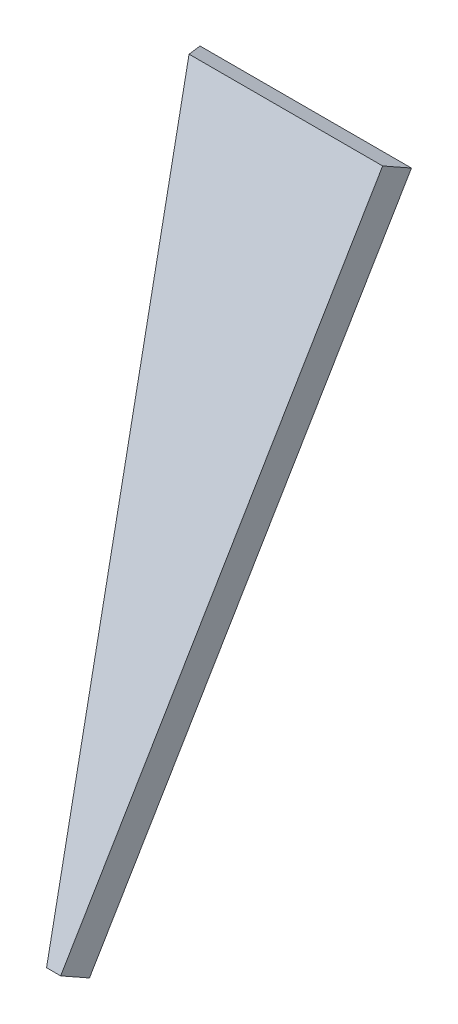
ISO-10303-21;
HEADER;
FILE_DESCRIPTION(('STEP AP214'),'2;1');
FILE_NAME('part.step','',(''),(''),'','','');
FILE_SCHEMA(('AUTOMOTIVE_DESIGN { 1 0 10303 214 1 1 1 1 }'));
ENDSEC;
DATA;
#1=APPLICATION_CONTEXT('core data for automotive mechanical design processes');
#2=APPLICATION_PROTOCOL_DEFINITION('international standard','automotive_design',2000,#1);
#3=PRODUCT_CONTEXT('',#1,'mechanical');
#4=PRODUCT('Part','Part','',(#3));
#5=PRODUCT_RELATED_PRODUCT_CATEGORY('part','',(#4));
#6=PRODUCT_DEFINITION_FORMATION('','',#4);
#7=PRODUCT_DEFINITION_CONTEXT('part definition',#1,'design');
#8=PRODUCT_DEFINITION('design','',#6,#7);
#9=PRODUCT_DEFINITION_SHAPE('','',#8);
#10=(LENGTH_UNIT() NAMED_UNIT(*) SI_UNIT(.MILLI.,.METRE.));
#11=(NAMED_UNIT(*) PLANE_ANGLE_UNIT() SI_UNIT($,.RADIAN.));
#12=(NAMED_UNIT(*) SI_UNIT($,.STERADIAN.) SOLID_ANGLE_UNIT());
#13=UNCERTAINTY_MEASURE_WITH_UNIT(LENGTH_MEASURE(1.E-05),#10,'distance_accuracy_value','');
#14=(GEOMETRIC_REPRESENTATION_CONTEXT(3) GLOBAL_UNCERTAINTY_ASSIGNED_CONTEXT((#13)) GLOBAL_UNIT_ASSIGNED_CONTEXT((#10,
#11,#12)) REPRESENTATION_CONTEXT('',''));
#15=CARTESIAN_POINT('',(0.,0.,0.));
#16=DIRECTION('',(0.,0.,1.));
#17=DIRECTION('',(1.,0.,0.));
#18=AXIS2_PLACEMENT_3D('',#15,#16,#17);
#19=CARTESIAN_POINT('',(48.6776760325675,362.607329490371,21.4180803513587));
#20=DIRECTION('',(0.915166256682117,0.0180699960875279,0.402671327352517));
#21=DIRECTION('',(0.402737084535447,0.,-0.91531570550269));
#22=AXIS2_PLACEMENT_3D('',#19,#20,#21);
#23=PLANE('',#22);
#24=DIRECTION('',(0.386982631379482,-0.318859858880206,-0.865201036410329));
#25=VECTOR('',#24,1.);
#26=CARTESIAN_POINT('',(23.4275750295006,39.9147073013639,93.2858615179995));
#27=LINE('',#26,#25);
#28=CARTESIAN_POINT('',(33.7053515526385,31.4461867373069,70.3072000000032));
#29=VERTEX_POINT('',#28);
#30=CARTESIAN_POINT('',(29.0416436027537,35.2889154237541,80.7341407062869));
#31=VERTEX_POINT('',#30);
#32=EDGE_CURVE('E97',#29,#31,#27,.F.);
#33=ORIENTED_EDGE('',*,*,#32,.F.);
#34=DIRECTION('',(0.132448179385618,0.930040822643922,-0.342755813945221));
#35=VECTOR('',#34,1.);
#36=CARTESIAN_POINT('',(76.9806046329947,335.321650799356,-41.6825960247318));
#37=LINE('',#36,#35);
#38=CARTESIAN_POINT('',(80.7295119640094,361.646186737307,-51.3842000000199));
#39=VERTEX_POINT('',#38);
#40=EDGE_CURVE('E85',#29,#39,#37,.T.);
#41=ORIENTED_EDGE('',*,*,#40,.T.);
#42=DIRECTION('',(0.386982631379482,-0.318859858880206,-0.865201036410329));
#43=VECTOR('',#42,1.);
#44=CARTESIAN_POINT('',(106.513451062562,340.401142345952,-109.030949548665));
#45=LINE('',#44,#43);
#46=CARTESIAN_POINT('',(76.0658040141246,365.488915423754,-40.9572592937362));
#47=VERTEX_POINT('',#46);
#48=EDGE_CURVE('E93',#47,#39,#45,.T.);
#49=ORIENTED_EDGE('',*,*,#48,.F.);
#50=DIRECTION('',(0.132448179385618,0.930040822643922,-0.342755813945221));
#51=VECTOR('',#50,1.);
#52=CARTESIAN_POINT('',(72.3987098741328,339.738865355184,-31.4673754569251));
#53=LINE('',#52,#51);
#54=EDGE_CURVE('E55',#31,#47,#53,.T.);
#55=ORIENTED_EDGE('',*,*,#54,.F.);
#56=EDGE_LOOP('',(#33,#41,#49,#55));
#57=FACE_BOUND('',#56,.T.);
#58=ADVANCED_FACE('F38',(#57),#23,.T.);
#59=CARTESIAN_POINT('',(-6.22609191666298,361.769121183095,2.73946802342179));
#60=DIRECTION('',(-0.915166256682498,0.0180699960866787,0.402671327351691));
#61=DIRECTION('',(0.402737084534614,0.,0.915315705503057));
#62=AXIS2_PLACEMENT_3D('',#59,#60,#61);
#63=PLANE('',#62);
#64=DIRECTION('',(0.386982631378429,0.318859858880358,0.865201036410744));
#65=VECTOR('',#64,1.);
#66=CARTESIAN_POINT('',(12.3298869272427,396.55978730235,43.3510968786001));
#67=LINE('',#66,#65);
#68=CARTESIAN_POINT('',(-30.0428252259831,361.646186737307,-51.3842000000199));
#69=VERTEX_POINT('',#68);
#70=CARTESIAN_POINT('',(-25.3791172761131,365.488915423754,-40.9572592937362));
#71=VERTEX_POINT('',#70);
#72=EDGE_CURVE('E95',#69,#71,#67,.T.);
#73=ORIENTED_EDGE('',*,*,#72,.F.);
#74=DIRECTION('',(0.132448179386108,-0.930040822643861,0.342755813945199));
#75=VECTOR('',#74,1.);
#76=CARTESIAN_POINT('',(-27.1830901220726,341.565349077537,-43.9836389824834));
#77=LINE('',#76,#75);
#78=CARTESIAN_POINT('',(16.9813351855648,31.4461867373068,70.3072000000032));
#79=VERTEX_POINT('',#78);
#80=EDGE_CURVE('E42',#69,#79,#77,.T.);
#81=ORIENTED_EDGE('',*,*,#80,.T.);
#82=DIRECTION('',(0.386982631378429,0.318859858880358,0.865201036410744));
#83=VECTOR('',#82,1.);
#84=CARTESIAN_POINT('',(9.20807304861993,25.0412965250574,52.9280364100997));
#85=LINE('',#84,#83);
#86=CARTESIAN_POINT('',(21.6450431354347,35.2889154237541,80.7341407062869));
#87=VERTEX_POINT('',#86);
#88=EDGE_CURVE('E105',#87,#79,#85,.F.);
#89=ORIENTED_EDGE('',*,*,#88,.F.);
#90=DIRECTION('',(0.132448179386108,-0.930040822643861,0.342755813945199));
#91=VECTOR('',#90,1.);
#92=CARTESIAN_POINT('',(-22.6011953632259,345.982563633365,-33.7684184146768));
#93=LINE('',#92,#91);
#94=EDGE_CURVE('E62',#71,#87,#93,.T.);
#95=ORIENTED_EDGE('',*,*,#94,.F.);
#96=EDGE_LOOP('',(#73,#81,#89,#95));
#97=FACE_BOUND('',#96,.T.);
#98=ADVANCED_FACE('F124',(#97),#63,.T.);
#99=CARTESIAN_POINT('',(252.903016686641,361.646186737307,-51.3842000000199));
#100=DIRECTION('',(0.,0.938307375143637,-0.345802356485694));
#101=DIRECTION('',(-1.,0.,0.));
#102=AXIS2_PLACEMENT_3D('',#99,#100,#101);
#103=PLANE('',#102);
#104=DIRECTION('',(1.,0.,0.));
#105=VECTOR('',#104,1.);
#106=CARTESIAN_POINT('',(0.,365.488915423754,-40.9572592937362));
#107=LINE('',#106,#105);
#108=EDGE_CURVE('E11',#47,#71,#107,.F.);
#109=ORIENTED_EDGE('',*,*,#108,.F.);
#110=ORIENTED_EDGE('',*,*,#48,.T.);
#111=DIRECTION('',(-1.,0.,0.));
#112=VECTOR('',#111,1.);
#113=CARTESIAN_POINT('',(252.903016686641,361.646186737307,-51.3842000000199));
#114=LINE('',#113,#112);
#115=EDGE_CURVE('E82',#39,#69,#114,.T.);
#116=ORIENTED_EDGE('',*,*,#115,.T.);
#117=ORIENTED_EDGE('',*,*,#72,.T.);
#118=EDGE_LOOP('',(#109,#110,#116,#117));
#119=FACE_BOUND('',#118,.T.);
#120=ADVANCED_FACE('F94',(#119),#103,.T.);
#121=CARTESIAN_POINT('',(-34.9249999999667,31.4461867373069,70.3072000000032));
#122=DIRECTION('',(0.,0.938307375143637,-0.345802356485694));
#123=DIRECTION('',(-1.,0.,0.));
#124=AXIS2_PLACEMENT_3D('',#121,#122,#123);
#125=PLANE('',#124);
#126=DIRECTION('',(-1.,0.,0.));
#127=VECTOR('',#126,1.);
#128=CARTESIAN_POINT('',(-34.9249999999667,31.4461867373069,70.3072000000032));
#129=LINE('',#128,#127);
#130=EDGE_CURVE('E90',#29,#79,#129,.T.);
#131=ORIENTED_EDGE('',*,*,#130,.F.);
#132=ORIENTED_EDGE('',*,*,#32,.T.);
#133=DIRECTION('',(1.,0.,0.));
#134=VECTOR('',#133,1.);
#135=CARTESIAN_POINT('',(0.,35.2889154237541,80.7341407062869));
#136=LINE('',#135,#134);
#137=EDGE_CURVE('E47',#31,#87,#136,.F.);
#138=ORIENTED_EDGE('',*,*,#137,.T.);
#139=ORIENTED_EDGE('',*,*,#88,.T.);
#140=EDGE_LOOP('',(#131,#132,#138,#139));
#141=FACE_BOUND('',#140,.T.);
#142=ADVANCED_FACE('F116',(#141),#125,.F.);
#143=CARTESIAN_POINT('',(0.,348.816340498756,-34.8127741809915));
#144=DIRECTION('',(0.,0.345802356485694,0.938307375143637));
#145=DIRECTION('',(0.,-0.938307375143637,0.345802356485694));
#146=AXIS2_PLACEMENT_3D('',#143,#144,#145);
#147=PLANE('',#146);
#148=ORIENTED_EDGE('',*,*,#137,.F.);
#149=ORIENTED_EDGE('',*,*,#54,.T.);
#150=ORIENTED_EDGE('',*,*,#108,.T.);
#151=ORIENTED_EDGE('',*,*,#94,.T.);
#152=EDGE_LOOP('',(#148,#149,#150,#151));
#153=FACE_BOUND('',#152,.T.);
#154=ADVANCED_FACE('F117',(#153),#147,.T.);
#155=CARTESIAN_POINT('',(0.,344.973611812309,-45.2397148872752));
#156=DIRECTION('',(0.,0.345802356485694,0.938307375143637));
#157=DIRECTION('',(0.,-0.938307375143637,0.345802356485694));
#158=AXIS2_PLACEMENT_3D('',#155,#156,#157);
#159=PLANE('',#158);
#160=ORIENTED_EDGE('',*,*,#40,.F.);
#161=ORIENTED_EDGE('',*,*,#130,.T.);
#162=ORIENTED_EDGE('',*,*,#80,.F.);
#163=ORIENTED_EDGE('',*,*,#115,.F.);
#164=EDGE_LOOP('',(#160,#161,#162,#163));
#165=FACE_BOUND('',#164,.T.);
#166=ADVANCED_FACE('F40',(#165),#159,.F.);
#167=CLOSED_SHELL('',(#58,#98,#120,#142,#154,#166));
#168=MANIFOLD_SOLID_BREP('B2',#167);
#169=ADVANCED_BREP_SHAPE_REPRESENTATION('',(#18,#168),#14);
#170=SHAPE_DEFINITION_REPRESENTATION(#9,#169);
ENDSEC;
END-ISO-10303-21;
